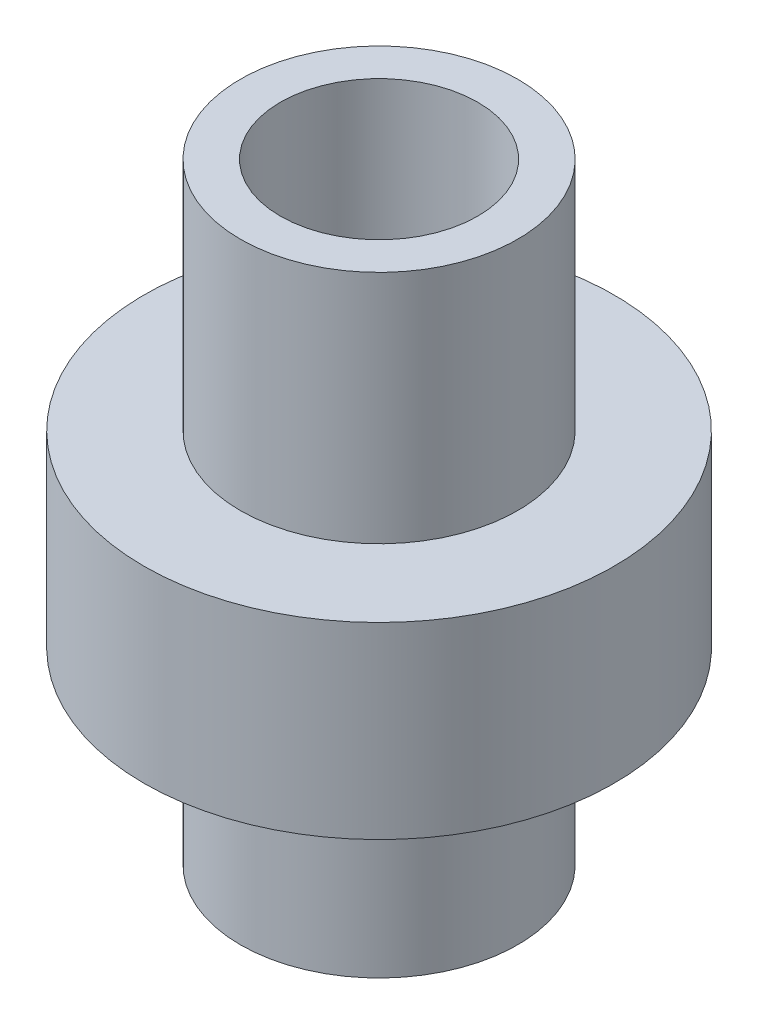
ISO-10303-21;
HEADER;
FILE_DESCRIPTION(('STEP AP214'),'2;1');
FILE_NAME('part.step','',(''),(''),'','','');
FILE_SCHEMA(('AUTOMOTIVE_DESIGN { 1 0 10303 214 1 1 1 1 }'));
ENDSEC;
DATA;
#1=APPLICATION_CONTEXT('core data for automotive mechanical design processes');
#2=APPLICATION_PROTOCOL_DEFINITION('international standard','automotive_design',2000,#1);
#3=PRODUCT_CONTEXT('',#1,'mechanical');
#4=PRODUCT('Part','Part','',(#3));
#5=PRODUCT_RELATED_PRODUCT_CATEGORY('part','',(#4));
#6=PRODUCT_DEFINITION_FORMATION('','',#4);
#7=PRODUCT_DEFINITION_CONTEXT('part definition',#1,'design');
#8=PRODUCT_DEFINITION('design','',#6,#7);
#9=PRODUCT_DEFINITION_SHAPE('','',#8);
#10=(LENGTH_UNIT() NAMED_UNIT(*) SI_UNIT(.MILLI.,.METRE.));
#11=(NAMED_UNIT(*) PLANE_ANGLE_UNIT() SI_UNIT($,.RADIAN.));
#12=(NAMED_UNIT(*) SI_UNIT($,.STERADIAN.) SOLID_ANGLE_UNIT());
#13=UNCERTAINTY_MEASURE_WITH_UNIT(LENGTH_MEASURE(1.E-05),#10,'distance_accuracy_value','');
#14=(GEOMETRIC_REPRESENTATION_CONTEXT(3) GLOBAL_UNCERTAINTY_ASSIGNED_CONTEXT((#13)) GLOBAL_UNIT_ASSIGNED_CONTEXT((#10,
#11,#12)) REPRESENTATION_CONTEXT('',''));
#15=CARTESIAN_POINT('',(0.,0.,0.));
#16=DIRECTION('',(0.,0.,1.));
#17=DIRECTION('',(1.,0.,0.));
#18=AXIS2_PLACEMENT_3D('',#15,#16,#17);
#19=CARTESIAN_POINT('',(0.,4.,0.));
#20=DIRECTION('',(0.,1.,0.));
#21=DIRECTION('',(0.,0.,1.));
#22=AXIS2_PLACEMENT_3D('',#19,#20,#21);
#23=PLANE('',#22);
#24=CARTESIAN_POINT('',(0.,4.,0.));
#25=DIRECTION('',(0.,1.,0.));
#26=DIRECTION('',(0.,0.,1.));
#27=AXIS2_PLACEMENT_3D('',#24,#25,#26);
#28=CIRCLE('',#27,2.5);
#29=CARTESIAN_POINT('',(0.,4.,2.5));
#30=VERTEX_POINT('',#29);
#31=EDGE_CURVE('E52',#30,#30,#28,.T.);
#32=ORIENTED_EDGE('',*,*,#31,.T.);
#33=EDGE_LOOP('',(#32));
#34=FACE_BOUND('',#33,.T.);
#35=CARTESIAN_POINT('',(0.,4.,0.));
#36=DIRECTION('',(0.,1.,0.));
#37=DIRECTION('',(0.,0.,1.));
#38=AXIS2_PLACEMENT_3D('',#35,#36,#37);
#39=CIRCLE('',#38,1.475);
#40=CARTESIAN_POINT('',(0.,4.,1.475));
#41=VERTEX_POINT('',#40);
#42=EDGE_CURVE('E59',#41,#41,#39,.T.);
#43=ORIENTED_EDGE('',*,*,#42,.F.);
#44=EDGE_LOOP('',(#43));
#45=FACE_BOUND('',#44,.T.);
#46=ADVANCED_FACE('F37',(#34,#45),#23,.T.);
#47=CARTESIAN_POINT('',(0.,0.,0.));
#48=DIRECTION('',(0.,1.,0.));
#49=DIRECTION('',(0.,0.,1.));
#50=AXIS2_PLACEMENT_3D('',#47,#48,#49);
#51=PLANE('',#50);
#52=CARTESIAN_POINT('',(0.,0.,0.));
#53=DIRECTION('',(0.,1.,0.));
#54=DIRECTION('',(0.,0.,1.));
#55=AXIS2_PLACEMENT_3D('',#52,#53,#54);
#56=CIRCLE('',#55,1.475);
#57=CARTESIAN_POINT('',(0.,0.,1.475));
#58=VERTEX_POINT('',#57);
#59=EDGE_CURVE('E41',#58,#58,#56,.T.);
#60=ORIENTED_EDGE('',*,*,#59,.F.);
#61=EDGE_LOOP('',(#60));
#62=FACE_BOUND('',#61,.T.);
#63=CARTESIAN_POINT('',(0.,0.,0.));
#64=DIRECTION('',(0.,1.,0.));
#65=DIRECTION('',(0.,0.,1.));
#66=AXIS2_PLACEMENT_3D('',#63,#64,#65);
#67=CIRCLE('',#66,1.05);
#68=CARTESIAN_POINT('',(0.,0.,1.05));
#69=VERTEX_POINT('',#68);
#70=EDGE_CURVE('E48',#69,#69,#67,.T.);
#71=ORIENTED_EDGE('',*,*,#70,.T.);
#72=EDGE_LOOP('',(#71));
#73=FACE_BOUND('',#72,.T.);
#74=ADVANCED_FACE('F85',(#62,#73),#51,.F.);
#75=CARTESIAN_POINT('',(0.,2.,0.));
#76=DIRECTION('',(0.,-1.,0.));
#77=DIRECTION('',(0.,0.,-1.));
#78=AXIS2_PLACEMENT_3D('',#75,#76,#77);
#79=CYLINDRICAL_SURFACE('',#78,1.475);
#80=CARTESIAN_POINT('',(0.,2.,0.));
#81=DIRECTION('',(0.,1.,0.));
#82=DIRECTION('',(0.,0.,1.));
#83=AXIS2_PLACEMENT_3D('',#80,#81,#82);
#84=CIRCLE('',#83,1.475);
#85=CARTESIAN_POINT('',(0.,2.,1.475));
#86=VERTEX_POINT('',#85);
#87=EDGE_CURVE('E11',#86,#86,#84,.T.);
#88=ORIENTED_EDGE('',*,*,#87,.F.);
#89=EDGE_LOOP('',(#88));
#90=FACE_BOUND('',#89,.T.);
#91=ORIENTED_EDGE('',*,*,#59,.T.);
#92=EDGE_LOOP('',(#91));
#93=FACE_BOUND('',#92,.T.);
#94=ADVANCED_FACE('F39',(#90,#93),#79,.T.);
#95=CARTESIAN_POINT('',(0.,2.,0.));
#96=DIRECTION('',(0.,-1.,0.));
#97=DIRECTION('',(0.,0.,-1.));
#98=AXIS2_PLACEMENT_3D('',#95,#96,#97);
#99=CYLINDRICAL_SURFACE('',#98,1.05);
#100=ORIENTED_EDGE('',*,*,#70,.F.);
#101=EDGE_LOOP('',(#100));
#102=FACE_BOUND('',#101,.T.);
#103=CARTESIAN_POINT('',(0.,6.5,0.));
#104=DIRECTION('',(0.,1.,0.));
#105=DIRECTION('',(0.,0.,1.));
#106=AXIS2_PLACEMENT_3D('',#103,#104,#105);
#107=CIRCLE('',#106,1.05);
#108=CARTESIAN_POINT('',(0.,6.5,1.05));
#109=VERTEX_POINT('',#108);
#110=EDGE_CURVE('E62',#109,#109,#107,.T.);
#111=ORIENTED_EDGE('',*,*,#110,.T.);
#112=EDGE_LOOP('',(#111));
#113=FACE_BOUND('',#112,.T.);
#114=ADVANCED_FACE('F68',(#102,#113),#99,.F.);
#115=CARTESIAN_POINT('',(0.,4.,0.));
#116=DIRECTION('',(0.,-1.,0.));
#117=DIRECTION('',(0.,0.,-1.));
#118=AXIS2_PLACEMENT_3D('',#115,#116,#117);
#119=CYLINDRICAL_SURFACE('',#118,2.5);
#120=ORIENTED_EDGE('',*,*,#31,.F.);
#121=EDGE_LOOP('',(#120));
#122=FACE_BOUND('',#121,.T.);
#123=CARTESIAN_POINT('',(0.,2.,0.));
#124=DIRECTION('',(0.,1.,0.));
#125=DIRECTION('',(0.,0.,1.));
#126=AXIS2_PLACEMENT_3D('',#123,#124,#125);
#127=CIRCLE('',#126,2.5);
#128=CARTESIAN_POINT('',(0.,2.,2.5));
#129=VERTEX_POINT('',#128);
#130=EDGE_CURVE('E53',#129,#129,#127,.T.);
#131=ORIENTED_EDGE('',*,*,#130,.T.);
#132=EDGE_LOOP('',(#131));
#133=FACE_BOUND('',#132,.T.);
#134=ADVANCED_FACE('F82',(#122,#133),#119,.T.);
#135=CARTESIAN_POINT('',(0.,2.,0.));
#136=DIRECTION('',(0.,1.,0.));
#137=DIRECTION('',(0.,0.,1.));
#138=AXIS2_PLACEMENT_3D('',#135,#136,#137);
#139=PLANE('',#138);
#140=ORIENTED_EDGE('',*,*,#87,.T.);
#141=EDGE_LOOP('',(#140));
#142=FACE_BOUND('',#141,.T.);
#143=ORIENTED_EDGE('',*,*,#130,.F.);
#144=EDGE_LOOP('',(#143));
#145=FACE_BOUND('',#144,.T.);
#146=ADVANCED_FACE('F73',(#142,#145),#139,.F.);
#147=CARTESIAN_POINT('',(0.,6.5,0.));
#148=DIRECTION('',(0.,1.,0.));
#149=DIRECTION('',(0.,0.,1.));
#150=AXIS2_PLACEMENT_3D('',#147,#148,#149);
#151=PLANE('',#150);
#152=CARTESIAN_POINT('',(0.,6.5,0.));
#153=DIRECTION('',(0.,1.,0.));
#154=DIRECTION('',(0.,0.,1.));
#155=AXIS2_PLACEMENT_3D('',#152,#153,#154);
#156=CIRCLE('',#155,1.475);
#157=CARTESIAN_POINT('',(0.,6.5,1.475));
#158=VERTEX_POINT('',#157);
#159=EDGE_CURVE('E56',#158,#158,#156,.T.);
#160=ORIENTED_EDGE('',*,*,#159,.T.);
#161=EDGE_LOOP('',(#160));
#162=FACE_BOUND('',#161,.T.);
#163=ORIENTED_EDGE('',*,*,#110,.F.);
#164=EDGE_LOOP('',(#163));
#165=FACE_BOUND('',#164,.T.);
#166=ADVANCED_FACE('F70',(#162,#165),#151,.T.);
#167=CARTESIAN_POINT('',(0.,6.5,0.));
#168=DIRECTION('',(0.,-1.,0.));
#169=DIRECTION('',(0.,0.,-1.));
#170=AXIS2_PLACEMENT_3D('',#167,#168,#169);
#171=CYLINDRICAL_SURFACE('',#170,1.475);
#172=ORIENTED_EDGE('',*,*,#159,.F.);
#173=EDGE_LOOP('',(#172));
#174=FACE_BOUND('',#173,.T.);
#175=ORIENTED_EDGE('',*,*,#42,.T.);
#176=EDGE_LOOP('',(#175));
#177=FACE_BOUND('',#176,.T.);
#178=ADVANCED_FACE('F72',(#174,#177),#171,.T.);
#179=CLOSED_SHELL('',(#46,#74,#94,#114,#134,#146,#166,#178));
#180=MANIFOLD_SOLID_BREP('B2',#179);
#181=ADVANCED_BREP_SHAPE_REPRESENTATION('',(#18,#180),#14);
#182=SHAPE_DEFINITION_REPRESENTATION(#9,#181);
ENDSEC;
END-ISO-10303-21;
